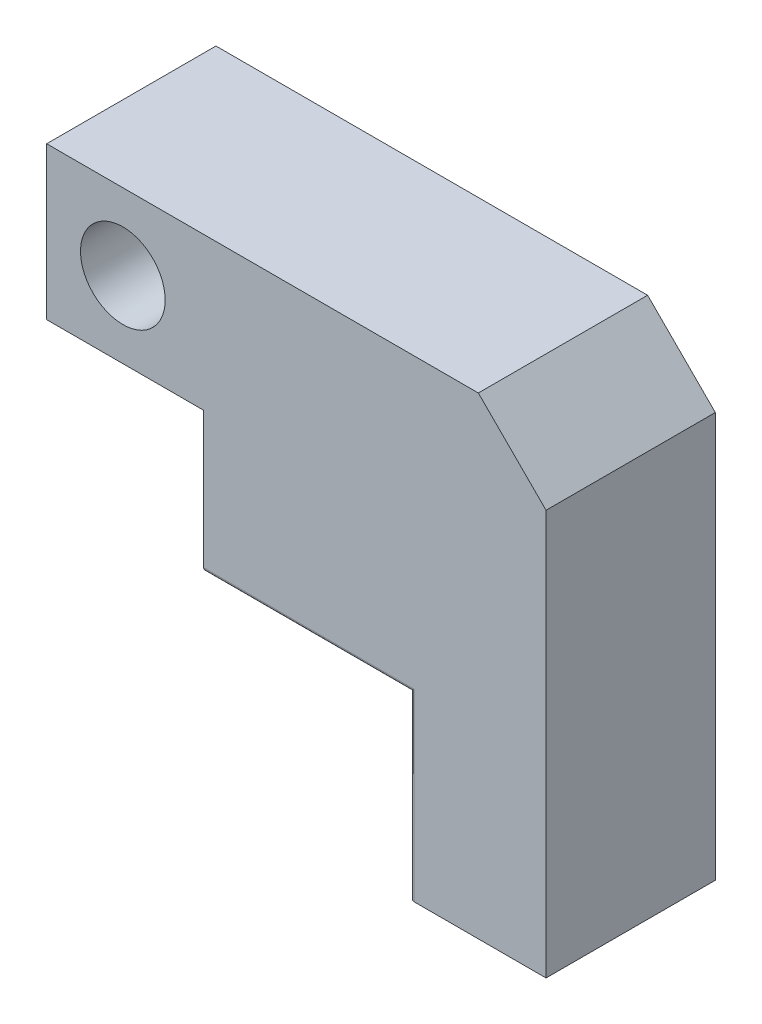
ISO-10303-21;
HEADER;
FILE_DESCRIPTION(('STEP AP214'),'2;1');
FILE_NAME('part.step','',(''),(''),'','','');
FILE_SCHEMA(('AUTOMOTIVE_DESIGN { 1 0 10303 214 1 1 1 1 }'));
ENDSEC;
DATA;
#1=APPLICATION_CONTEXT('core data for automotive mechanical design processes');
#2=APPLICATION_PROTOCOL_DEFINITION('international standard','automotive_design',2000,#1);
#3=PRODUCT_CONTEXT('',#1,'mechanical');
#4=PRODUCT('Part','Part','',(#3));
#5=PRODUCT_RELATED_PRODUCT_CATEGORY('part','',(#4));
#6=PRODUCT_DEFINITION_FORMATION('','',#4);
#7=PRODUCT_DEFINITION_CONTEXT('part definition',#1,'design');
#8=PRODUCT_DEFINITION('design','',#6,#7);
#9=PRODUCT_DEFINITION_SHAPE('','',#8);
#10=(LENGTH_UNIT() NAMED_UNIT(*) SI_UNIT(.MILLI.,.METRE.));
#11=(NAMED_UNIT(*) PLANE_ANGLE_UNIT() SI_UNIT($,.RADIAN.));
#12=(NAMED_UNIT(*) SI_UNIT($,.STERADIAN.) SOLID_ANGLE_UNIT());
#13=UNCERTAINTY_MEASURE_WITH_UNIT(LENGTH_MEASURE(1.E-05),#10,'distance_accuracy_value','');
#14=(GEOMETRIC_REPRESENTATION_CONTEXT(3) GLOBAL_UNCERTAINTY_ASSIGNED_CONTEXT((#13)) GLOBAL_UNIT_ASSIGNED_CONTEXT((#10,
#11,#12)) REPRESENTATION_CONTEXT('',''));
#15=CARTESIAN_POINT('',(0.,0.,0.));
#16=DIRECTION('',(0.,0.,1.));
#17=DIRECTION('',(1.,0.,0.));
#18=AXIS2_PLACEMENT_3D('',#15,#16,#17);
#19=CARTESIAN_POINT('',(25.0000000131859,-23.4294027338573,10.));
#20=DIRECTION('',(0.,0.,1.));
#21=DIRECTION('',(1.,0.,0.));
#22=AXIS2_PLACEMENT_3D('',#19,#20,#21);
#23=PLANE('',#22);
#24=DIRECTION('',(1.,0.,0.));
#25=VECTOR('',#24,1.);
#26=CARTESIAN_POINT('',(17.0000000131859,-12.5540845162202,10.));
#27=LINE('',#26,#25);
#28=CARTESIAN_POINT('',(4.77654226619651,-12.5540845162202,10.));
#29=VERTEX_POINT('',#28);
#30=CARTESIAN_POINT('',(17.2000000131859,-12.5540845162202,10.));
#31=VERTEX_POINT('',#30);
#32=EDGE_CURVE('E193',#29,#31,#27,.T.);
#33=ORIENTED_EDGE('',*,*,#32,.T.);
#34=DIRECTION('',(0.,-1.,0.));
#35=VECTOR('',#34,1.);
#36=CARTESIAN_POINT('',(17.2000000131859,-23.4294027338573,10.));
#37=LINE('',#36,#35);
#38=CARTESIAN_POINT('',(17.2000000131859,-23.4294027338573,10.));
#39=VERTEX_POINT('',#38);
#40=EDGE_CURVE('E195',#31,#39,#37,.T.);
#41=ORIENTED_EDGE('',*,*,#40,.T.);
#42=DIRECTION('',(1.,0.,0.));
#43=VECTOR('',#42,1.);
#44=CARTESIAN_POINT('',(17.0000000131859,-23.4294027338573,10.));
#45=LINE('',#44,#43);
#46=CARTESIAN_POINT('',(25.0000000131859,-23.4294027338573,10.));
#47=VERTEX_POINT('',#46);
#48=EDGE_CURVE('E157',#39,#47,#45,.T.);
#49=ORIENTED_EDGE('',*,*,#48,.T.);
#50=DIRECTION('',(0.,1.,0.));
#51=VECTOR('',#50,1.);
#52=CARTESIAN_POINT('',(25.0000000131859,4.5,10.));
#53=LINE('',#52,#51);
#54=CARTESIAN_POINT('',(25.0000000131859,0.499999999999998,10.));
#55=VERTEX_POINT('',#54);
#56=EDGE_CURVE('E134',#47,#55,#53,.T.);
#57=ORIENTED_EDGE('',*,*,#56,.T.);
#58=DIRECTION('',(0.707106781186546,-0.707106781186549,0.));
#59=VECTOR('',#58,1.);
#60=CARTESIAN_POINT('',(36.9647013801146,-11.4647013669287,10.));
#61=LINE('',#60,#59);
#62=CARTESIAN_POINT('',(21.0000000131859,4.5,10.));
#63=VERTEX_POINT('',#62);
#64=EDGE_CURVE('E130',#55,#63,#61,.F.);
#65=ORIENTED_EDGE('',*,*,#64,.T.);
#66=DIRECTION('',(-1.,0.,0.));
#67=VECTOR('',#66,1.);
#68=CARTESIAN_POINT('',(-4.5,4.5,10.));
#69=LINE('',#68,#67);
#70=CARTESIAN_POINT('',(-4.5,4.5,10.));
#71=VERTEX_POINT('',#70);
#72=EDGE_CURVE('E122',#63,#71,#69,.T.);
#73=ORIENTED_EDGE('',*,*,#72,.T.);
#74=DIRECTION('',(0.,-1.,0.));
#75=VECTOR('',#74,1.);
#76=CARTESIAN_POINT('',(-4.5,4.5,10.));
#77=LINE('',#76,#75);
#78=CARTESIAN_POINT('',(-4.5,-4.5,10.));
#79=VERTEX_POINT('',#78);
#80=EDGE_CURVE('E126',#71,#79,#77,.T.);
#81=ORIENTED_EDGE('',*,*,#80,.T.);
#82=DIRECTION('',(1.,0.,0.));
#83=VECTOR('',#82,1.);
#84=CARTESIAN_POINT('',(-4.5,-4.5,10.));
#85=LINE('',#84,#83);
#86=CARTESIAN_POINT('',(4.77654226619651,-4.5,10.));
#87=VERTEX_POINT('',#86);
#88=EDGE_CURVE('E149',#79,#87,#85,.T.);
#89=ORIENTED_EDGE('',*,*,#88,.T.);
#90=DIRECTION('',(0.,-1.,0.));
#91=VECTOR('',#90,1.);
#92=CARTESIAN_POINT('',(4.77654226619651,-4.5,10.));
#93=LINE('',#92,#91);
#94=EDGE_CURVE('E151',#87,#29,#93,.T.);
#95=ORIENTED_EDGE('',*,*,#94,.T.);
#96=EDGE_LOOP('',(#33,#41,#49,#57,#65,#73,#81,#89,#95));
#97=FACE_BOUND('',#96,.T.);
#98=CARTESIAN_POINT('',(0.,0.,10.));
#99=DIRECTION('',(0.,0.,1.));
#100=DIRECTION('',(1.,0.,0.));
#101=AXIS2_PLACEMENT_3D('',#98,#99,#100);
#102=CIRCLE('',#101,2.5);
#103=CARTESIAN_POINT('',(2.5,0.,10.));
#104=VERTEX_POINT('',#103);
#105=EDGE_CURVE('E163',#104,#104,#102,.T.);
#106=ORIENTED_EDGE('',*,*,#105,.F.);
#107=EDGE_LOOP('',(#106));
#108=FACE_BOUND('',#107,.T.);
#109=ADVANCED_FACE('F32',(#97,#108),#23,.T.);
#110=CARTESIAN_POINT('',(25.0000000131859,-23.4294027338573,0.));
#111=DIRECTION('',(0.,0.,1.));
#112=DIRECTION('',(1.,0.,0.));
#113=AXIS2_PLACEMENT_3D('',#110,#111,#112);
#114=PLANE('',#113);
#115=DIRECTION('',(1.,0.,0.));
#116=VECTOR('',#115,1.);
#117=CARTESIAN_POINT('',(17.0000000131859,-23.4294027338573,0.));
#118=LINE('',#117,#116);
#119=CARTESIAN_POINT('',(17.2000000131859,-23.4294027338573,0.));
#120=VERTEX_POINT('',#119);
#121=CARTESIAN_POINT('',(25.0000000131859,-23.4294027338573,0.));
#122=VERTEX_POINT('',#121);
#123=EDGE_CURVE('E171',#120,#122,#118,.T.);
#124=ORIENTED_EDGE('',*,*,#123,.F.);
#125=DIRECTION('',(0.,-1.,0.));
#126=VECTOR('',#125,1.);
#127=CARTESIAN_POINT('',(17.2000000131859,-23.4294027338573,0.));
#128=LINE('',#127,#126);
#129=CARTESIAN_POINT('',(17.2000000131859,-12.5540845162202,0.));
#130=VERTEX_POINT('',#129);
#131=EDGE_CURVE('E209',#120,#130,#128,.F.);
#132=ORIENTED_EDGE('',*,*,#131,.T.);
#133=DIRECTION('',(1.,0.,0.));
#134=VECTOR('',#133,1.);
#135=CARTESIAN_POINT('',(25.0000000131859,-12.5540845162202,0.));
#136=LINE('',#135,#134);
#137=CARTESIAN_POINT('',(4.77654226619651,-12.5540845162202,0.));
#138=VERTEX_POINT('',#137);
#139=EDGE_CURVE('E207',#130,#138,#136,.F.);
#140=ORIENTED_EDGE('',*,*,#139,.T.);
#141=DIRECTION('',(0.,-1.,0.));
#142=VECTOR('',#141,1.);
#143=CARTESIAN_POINT('',(4.77654226619651,-4.5,0.));
#144=LINE('',#143,#142);
#145=CARTESIAN_POINT('',(4.77654226619651,-4.5,0.));
#146=VERTEX_POINT('',#145);
#147=EDGE_CURVE('E169',#146,#138,#144,.T.);
#148=ORIENTED_EDGE('',*,*,#147,.F.);
#149=DIRECTION('',(1.,0.,0.));
#150=VECTOR('',#149,1.);
#151=CARTESIAN_POINT('',(-4.5,-4.5,0.));
#152=LINE('',#151,#150);
#153=CARTESIAN_POINT('',(-4.5,-4.5,0.));
#154=VERTEX_POINT('',#153);
#155=EDGE_CURVE('E167',#154,#146,#152,.T.);
#156=ORIENTED_EDGE('',*,*,#155,.F.);
#157=DIRECTION('',(0.,-1.,0.));
#158=VECTOR('',#157,1.);
#159=CARTESIAN_POINT('',(-4.5,4.5,0.));
#160=LINE('',#159,#158);
#161=CARTESIAN_POINT('',(-4.5,4.5,0.));
#162=VERTEX_POINT('',#161);
#163=EDGE_CURVE('E165',#162,#154,#160,.T.);
#164=ORIENTED_EDGE('',*,*,#163,.F.);
#165=DIRECTION('',(-1.,0.,0.));
#166=VECTOR('',#165,1.);
#167=CARTESIAN_POINT('',(-4.5,4.5,0.));
#168=LINE('',#167,#166);
#169=CARTESIAN_POINT('',(21.0000000131859,4.5,0.));
#170=VERTEX_POINT('',#169);
#171=EDGE_CURVE('E140',#170,#162,#168,.T.);
#172=ORIENTED_EDGE('',*,*,#171,.F.);
#173=DIRECTION('',(-0.707106781186546,0.707106781186549,0.));
#174=VECTOR('',#173,1.);
#175=CARTESIAN_POINT('',(21.0000000131859,4.5,0.));
#176=LINE('',#175,#174);
#177=CARTESIAN_POINT('',(25.0000000131859,0.499999999999989,0.));
#178=VERTEX_POINT('',#177);
#179=EDGE_CURVE('E188',#170,#178,#176,.F.);
#180=ORIENTED_EDGE('',*,*,#179,.T.);
#181=DIRECTION('',(0.,1.,0.));
#182=VECTOR('',#181,1.);
#183=CARTESIAN_POINT('',(25.0000000131859,4.5,0.));
#184=LINE('',#183,#182);
#185=EDGE_CURVE('E160',#122,#178,#184,.T.);
#186=ORIENTED_EDGE('',*,*,#185,.F.);
#187=EDGE_LOOP('',(#124,#132,#140,#148,#156,#164,#172,#180,#186));
#188=FACE_BOUND('',#187,.T.);
#189=CARTESIAN_POINT('',(0.,0.,0.));
#190=DIRECTION('',(0.,0.,1.));
#191=DIRECTION('',(1.,0.,0.));
#192=AXIS2_PLACEMENT_3D('',#189,#190,#191);
#193=CIRCLE('',#192,2.5);
#194=CARTESIAN_POINT('',(2.5,0.,0.));
#195=VERTEX_POINT('',#194);
#196=EDGE_CURVE('E418',#195,#195,#193,.T.);
#197=ORIENTED_EDGE('',*,*,#196,.T.);
#198=EDGE_LOOP('',(#197));
#199=FACE_BOUND('',#198,.T.);
#200=ADVANCED_FACE('F236',(#188,#199),#114,.F.);
#201=CARTESIAN_POINT('',(25.0000000131859,4.5,10.));
#202=DIRECTION('',(-1.,0.,0.));
#203=DIRECTION('',(0.,-1.,0.));
#204=AXIS2_PLACEMENT_3D('',#201,#202,#203);
#205=PLANE('',#204);
#206=ORIENTED_EDGE('',*,*,#185,.T.);
#207=DIRECTION('',(0.,0.,1.));
#208=VECTOR('',#207,1.);
#209=CARTESIAN_POINT('',(25.0000000131859,0.499999999999989,10.));
#210=LINE('',#209,#208);
#211=EDGE_CURVE('E190',#178,#55,#210,.T.);
#212=ORIENTED_EDGE('',*,*,#211,.T.);
#213=ORIENTED_EDGE('',*,*,#56,.F.);
#214=DIRECTION('',(0.,0.,-1.));
#215=VECTOR('',#214,1.);
#216=CARTESIAN_POINT('',(25.0000000131859,-23.4294027338573,10.));
#217=LINE('',#216,#215);
#218=EDGE_CURVE('E159',#47,#122,#217,.T.);
#219=ORIENTED_EDGE('',*,*,#218,.T.);
#220=EDGE_LOOP('',(#206,#212,#213,#219));
#221=FACE_BOUND('',#220,.T.);
#222=ADVANCED_FACE('F248',(#221),#205,.F.);
#223=CARTESIAN_POINT('',(-4.5,4.5,10.));
#224=DIRECTION('',(0.,-1.,0.));
#225=DIRECTION('',(0.,0.,-1.));
#226=AXIS2_PLACEMENT_3D('',#223,#224,#225);
#227=PLANE('',#226);
#228=ORIENTED_EDGE('',*,*,#72,.F.);
#229=DIRECTION('',(0.,0.,-1.));
#230=VECTOR('',#229,1.);
#231=CARTESIAN_POINT('',(21.0000000131859,4.5,10.));
#232=LINE('',#231,#230);
#233=EDGE_CURVE('E143',#63,#170,#232,.T.);
#234=ORIENTED_EDGE('',*,*,#233,.T.);
#235=ORIENTED_EDGE('',*,*,#171,.T.);
#236=DIRECTION('',(0.,0.,-1.));
#237=VECTOR('',#236,1.);
#238=CARTESIAN_POINT('',(-4.5,4.5,10.));
#239=LINE('',#238,#237);
#240=EDGE_CURVE('E137',#71,#162,#239,.T.);
#241=ORIENTED_EDGE('',*,*,#240,.F.);
#242=EDGE_LOOP('',(#228,#234,#235,#241));
#243=FACE_BOUND('',#242,.T.);
#244=ADVANCED_FACE('F138',(#243),#227,.F.);
#245=CARTESIAN_POINT('',(-4.5,4.5,10.));
#246=DIRECTION('',(1.,0.,0.));
#247=DIRECTION('',(0.,1.,0.));
#248=AXIS2_PLACEMENT_3D('',#245,#246,#247);
#249=PLANE('',#248);
#250=ORIENTED_EDGE('',*,*,#163,.T.);
#251=DIRECTION('',(0.,0.,-1.));
#252=VECTOR('',#251,1.);
#253=CARTESIAN_POINT('',(-4.5,-4.5,10.));
#254=LINE('',#253,#252);
#255=EDGE_CURVE('E144',#79,#154,#254,.T.);
#256=ORIENTED_EDGE('',*,*,#255,.F.);
#257=ORIENTED_EDGE('',*,*,#80,.F.);
#258=ORIENTED_EDGE('',*,*,#240,.T.);
#259=EDGE_LOOP('',(#250,#256,#257,#258));
#260=FACE_BOUND('',#259,.T.);
#261=ADVANCED_FACE('F146',(#260),#249,.F.);
#262=CARTESIAN_POINT('',(-4.5,-4.5,10.));
#263=DIRECTION('',(0.,1.,0.));
#264=DIRECTION('',(0.,0.,1.));
#265=AXIS2_PLACEMENT_3D('',#262,#263,#264);
#266=PLANE('',#265);
#267=ORIENTED_EDGE('',*,*,#155,.T.);
#268=DIRECTION('',(0.,0.,-1.));
#269=VECTOR('',#268,1.);
#270=CARTESIAN_POINT('',(4.77654226619651,-4.5,10.));
#271=LINE('',#270,#269);
#272=EDGE_CURVE('E183',#87,#146,#271,.T.);
#273=ORIENTED_EDGE('',*,*,#272,.F.);
#274=ORIENTED_EDGE('',*,*,#88,.F.);
#275=ORIENTED_EDGE('',*,*,#255,.T.);
#276=EDGE_LOOP('',(#267,#273,#274,#275));
#277=FACE_BOUND('',#276,.T.);
#278=ADVANCED_FACE('F243',(#277),#266,.F.);
#279=CARTESIAN_POINT('',(4.77654226619651,-4.5,10.));
#280=DIRECTION('',(1.,0.,0.));
#281=DIRECTION('',(0.,0.,-1.));
#282=AXIS2_PLACEMENT_3D('',#279,#280,#281);
#283=PLANE('',#282);
#284=ORIENTED_EDGE('',*,*,#147,.T.);
#285=CARTESIAN_POINT('',(4.77654226619651,-12.5540845162202,0.200000000000001));
#286=DIRECTION('',(1.,0.,0.));
#287=DIRECTION('',(0.,0.,-1.));
#288=AXIS2_PLACEMENT_3D('',#285,#286,#287);
#289=CIRCLE('',#288,0.2);
#290=CARTESIAN_POINT('',(4.77654226619651,-12.7540845162202,0.200000000000001));
#291=VERTEX_POINT('',#290);
#292=EDGE_CURVE('E11',#138,#291,#289,.F.);
#293=ORIENTED_EDGE('',*,*,#292,.T.);
#294=DIRECTION('',(0.,0.,-1.));
#295=VECTOR('',#294,1.);
#296=CARTESIAN_POINT('',(4.77654226619651,-12.7540845162202,10.));
#297=LINE('',#296,#295);
#298=CARTESIAN_POINT('',(4.77654226619651,-12.7540845162202,9.8));
#299=VERTEX_POINT('',#298);
#300=EDGE_CURVE('E181',#299,#291,#297,.T.);
#301=ORIENTED_EDGE('',*,*,#300,.F.);
#302=CARTESIAN_POINT('',(4.77654226619651,-12.5540845162202,9.8));
#303=DIRECTION('',(1.,0.,0.));
#304=DIRECTION('',(0.,0.,-1.));
#305=AXIS2_PLACEMENT_3D('',#302,#303,#304);
#306=CIRCLE('',#305,0.2);
#307=EDGE_CURVE('E41',#299,#29,#306,.F.);
#308=ORIENTED_EDGE('',*,*,#307,.T.);
#309=ORIENTED_EDGE('',*,*,#94,.F.);
#310=ORIENTED_EDGE('',*,*,#272,.T.);
#311=EDGE_LOOP('',(#284,#293,#301,#308,#309,#310));
#312=FACE_BOUND('',#311,.T.);
#313=ADVANCED_FACE('F239',(#312),#283,.F.);
#314=CARTESIAN_POINT('',(4.77654226619651,-12.7540845162202,10.));
#315=DIRECTION('',(0.,1.,0.));
#316=DIRECTION('',(0.,0.,1.));
#317=AXIS2_PLACEMENT_3D('',#314,#315,#316);
#318=PLANE('',#317);
#319=ORIENTED_EDGE('',*,*,#300,.T.);
#320=DIRECTION('',(1.,0.,0.));
#321=VECTOR('',#320,1.);
#322=CARTESIAN_POINT('',(4.77654226619651,-12.7540845162202,0.200000000000001));
#323=LINE('',#322,#321);
#324=CARTESIAN_POINT('',(17.0000000131859,-12.7540845162202,0.200000000000001));
#325=VERTEX_POINT('',#324);
#326=EDGE_CURVE('E212',#291,#325,#323,.T.);
#327=ORIENTED_EDGE('',*,*,#326,.T.);
#328=DIRECTION('',(0.,0.,-1.));
#329=VECTOR('',#328,1.);
#330=CARTESIAN_POINT('',(17.0000000131859,-12.7540845162202,10.));
#331=LINE('',#330,#329);
#332=CARTESIAN_POINT('',(17.0000000131859,-12.7540845162202,9.8));
#333=VERTEX_POINT('',#332);
#334=EDGE_CURVE('E178',#333,#325,#331,.T.);
#335=ORIENTED_EDGE('',*,*,#334,.F.);
#336=DIRECTION('',(1.,0.,0.));
#337=VECTOR('',#336,1.);
#338=CARTESIAN_POINT('',(4.77654226619651,-12.7540845162202,9.8));
#339=LINE('',#338,#337);
#340=EDGE_CURVE('E54',#333,#299,#339,.F.);
#341=ORIENTED_EDGE('',*,*,#340,.T.);
#342=EDGE_LOOP('',(#319,#327,#335,#341));
#343=FACE_BOUND('',#342,.T.);
#344=ADVANCED_FACE('F285',(#343),#318,.F.);
#345=CARTESIAN_POINT('',(17.0000000131859,-23.4294027338573,10.));
#346=DIRECTION('',(1.,0.,0.));
#347=DIRECTION('',(0.,0.,-1.));
#348=AXIS2_PLACEMENT_3D('',#345,#346,#347);
#349=PLANE('',#348);
#350=DIRECTION('',(0.,0.,-1.));
#351=VECTOR('',#350,1.);
#352=CARTESIAN_POINT('',(17.0000000131859,-23.4294027338573,10.));
#353=LINE('',#352,#351);
#354=CARTESIAN_POINT('',(17.0000000131859,-23.4294027338573,9.8));
#355=VERTEX_POINT('',#354);
#356=CARTESIAN_POINT('',(17.0000000131859,-23.4294027338573,0.200000000000001));
#357=VERTEX_POINT('',#356);
#358=EDGE_CURVE('E175',#355,#357,#353,.T.);
#359=ORIENTED_EDGE('',*,*,#358,.F.);
#360=DIRECTION('',(0.,-1.,0.));
#361=VECTOR('',#360,1.);
#362=CARTESIAN_POINT('',(17.0000000131859,-12.7540845162202,9.8));
#363=LINE('',#362,#361);
#364=EDGE_CURVE('E205',#355,#333,#363,.F.);
#365=ORIENTED_EDGE('',*,*,#364,.T.);
#366=ORIENTED_EDGE('',*,*,#334,.T.);
#367=DIRECTION('',(0.,-1.,0.));
#368=VECTOR('',#367,1.);
#369=CARTESIAN_POINT('',(17.0000000131859,-23.4294027338573,0.200000000000001));
#370=LINE('',#369,#368);
#371=EDGE_CURVE('E202',#325,#357,#370,.T.);
#372=ORIENTED_EDGE('',*,*,#371,.T.);
#373=EDGE_LOOP('',(#359,#365,#366,#372));
#374=FACE_BOUND('',#373,.T.);
#375=ADVANCED_FACE('F281',(#374),#349,.F.);
#376=CARTESIAN_POINT('',(17.0000000131859,-23.4294027338573,10.));
#377=DIRECTION('',(0.,1.,0.));
#378=DIRECTION('',(0.,0.,1.));
#379=AXIS2_PLACEMENT_3D('',#376,#377,#378);
#380=PLANE('',#379);
#381=CARTESIAN_POINT('',(21.0000000131859,-23.4294027338573,5.));
#382=DIRECTION('',(0.,-1.,0.));
#383=DIRECTION('',(0.,0.,-1.));
#384=AXIS2_PLACEMENT_3D('',#381,#382,#383);
#385=CIRCLE('',#384,2.5);
#386=CARTESIAN_POINT('',(21.0000000131859,-23.4294027338573,2.5));
#387=VERTEX_POINT('',#386);
#388=EDGE_CURVE('E216',#387,#387,#385,.T.);
#389=ORIENTED_EDGE('',*,*,#388,.F.);
#390=EDGE_LOOP('',(#389));
#391=FACE_BOUND('',#390,.T.);
#392=ORIENTED_EDGE('',*,*,#48,.F.);
#393=CARTESIAN_POINT('',(17.2000000131859,-23.4294027338573,9.8));
#394=DIRECTION('',(0.,1.,0.));
#395=DIRECTION('',(0.,0.,1.));
#396=AXIS2_PLACEMENT_3D('',#393,#394,#395);
#397=CIRCLE('',#396,0.2);
#398=EDGE_CURVE('E200',#39,#355,#397,.F.);
#399=ORIENTED_EDGE('',*,*,#398,.T.);
#400=ORIENTED_EDGE('',*,*,#358,.T.);
#401=CARTESIAN_POINT('',(17.2000000131859,-23.4294027338573,0.200000000000001));
#402=DIRECTION('',(0.,1.,0.));
#403=DIRECTION('',(0.,0.,1.));
#404=AXIS2_PLACEMENT_3D('',#401,#402,#403);
#405=CIRCLE('',#404,0.2);
#406=EDGE_CURVE('E198',#357,#120,#405,.F.);
#407=ORIENTED_EDGE('',*,*,#406,.T.);
#408=ORIENTED_EDGE('',*,*,#123,.T.);
#409=ORIENTED_EDGE('',*,*,#218,.F.);
#410=EDGE_LOOP('',(#392,#399,#400,#407,#408,#409));
#411=FACE_BOUND('',#410,.T.);
#412=ADVANCED_FACE('F278',(#391,#411),#380,.F.);
#413=CARTESIAN_POINT('',(0.,0.,10.));
#414=DIRECTION('',(0.,0.,-1.));
#415=DIRECTION('',(-1.,0.,0.));
#416=AXIS2_PLACEMENT_3D('',#413,#414,#415);
#417=CYLINDRICAL_SURFACE('',#416,2.5);
#418=ORIENTED_EDGE('',*,*,#105,.T.);
#419=EDGE_LOOP('',(#418));
#420=FACE_BOUND('',#419,.T.);
#421=ORIENTED_EDGE('',*,*,#196,.F.);
#422=EDGE_LOOP('',(#421));
#423=FACE_BOUND('',#422,.T.);
#424=ADVANCED_FACE('F275',(#420,#423),#417,.F.);
#425=CARTESIAN_POINT('',(21.0000000131859,-3.4294027338573,5.));
#426=DIRECTION('',(0.,-1.,0.));
#427=DIRECTION('',(0.,0.,-1.));
#428=AXIS2_PLACEMENT_3D('',#425,#426,#427);
#429=CYLINDRICAL_SURFACE('',#428,2.5);
#430=CARTESIAN_POINT('',(21.0000000131859,-3.4294027338573,5.));
#431=DIRECTION('',(0.,-1.,0.));
#432=DIRECTION('',(0.,0.,-1.));
#433=AXIS2_PLACEMENT_3D('',#430,#431,#432);
#434=CIRCLE('',#433,2.5);
#435=CARTESIAN_POINT('',(21.0000000131859,-3.4294027338573,2.5));
#436=VERTEX_POINT('',#435);
#437=EDGE_CURVE('E222',#436,#436,#434,.T.);
#438=ORIENTED_EDGE('',*,*,#437,.F.);
#439=EDGE_LOOP('',(#438));
#440=FACE_BOUND('',#439,.T.);
#441=ORIENTED_EDGE('',*,*,#388,.T.);
#442=EDGE_LOOP('',(#441));
#443=FACE_BOUND('',#442,.T.);
#444=ADVANCED_FACE('F263',(#440,#443),#429,.F.);
#445=CARTESIAN_POINT('',(21.0000000131859,-3.4294027338573,5.));
#446=DIRECTION('',(0.,-1.,0.));
#447=DIRECTION('',(0.,0.,-1.));
#448=AXIS2_PLACEMENT_3D('',#445,#446,#447);
#449=PLANE('',#448);
#450=ORIENTED_EDGE('',*,*,#437,.T.);
#451=EDGE_LOOP('',(#450));
#452=FACE_BOUND('',#451,.T.);
#453=ADVANCED_FACE('F254',(#452),#449,.T.);
#454=CARTESIAN_POINT('',(21.0000000131859,4.5,10.));
#455=DIRECTION('',(-0.707106781186549,-0.707106781186546,0.));
#456=DIRECTION('',(0.707106781186546,-0.707106781186549,0.));
#457=AXIS2_PLACEMENT_3D('',#454,#455,#456);
#458=PLANE('',#457);
#459=ORIENTED_EDGE('',*,*,#64,.F.);
#460=ORIENTED_EDGE('',*,*,#211,.F.);
#461=ORIENTED_EDGE('',*,*,#179,.F.);
#462=ORIENTED_EDGE('',*,*,#233,.F.);
#463=EDGE_LOOP('',(#459,#460,#461,#462));
#464=FACE_BOUND('',#463,.T.);
#465=ADVANCED_FACE('F251',(#464),#458,.F.);
#466=CARTESIAN_POINT('',(25.0000000131859,-12.5540845162202,9.8));
#467=DIRECTION('',(-1.,0.,0.));
#468=DIRECTION('',(0.,0.,1.));
#469=AXIS2_PLACEMENT_3D('',#466,#467,#468);
#470=CYLINDRICAL_SURFACE('',#469,0.2);
#471=ORIENTED_EDGE('',*,*,#307,.F.);
#472=ORIENTED_EDGE('',*,*,#340,.F.);
#473=CARTESIAN_POINT('',(17.2000000131859,-12.5540845162202,9.8));
#474=DIRECTION('',(-0.707106781186547,0.707106781186547,0.));
#475=DIRECTION('',(0.707106781186547,0.707106781186547,0.));
#476=AXIS2_PLACEMENT_3D('',#473,#474,#475);
#477=ELLIPSE('',#476,0.282842712474619,0.2);
#478=EDGE_CURVE('E214',#31,#333,#477,.F.);
#479=ORIENTED_EDGE('',*,*,#478,.F.);
#480=ORIENTED_EDGE('',*,*,#32,.F.);
#481=EDGE_LOOP('',(#471,#472,#479,#480));
#482=FACE_BOUND('',#481,.T.);
#483=ADVANCED_FACE('F253',(#482),#470,.T.);
#484=CARTESIAN_POINT('',(17.2000000131859,-23.4294027338573,9.8));
#485=DIRECTION('',(0.,1.,0.));
#486=DIRECTION('',(0.,0.,1.));
#487=AXIS2_PLACEMENT_3D('',#484,#485,#486);
#488=CYLINDRICAL_SURFACE('',#487,0.2);
#489=ORIENTED_EDGE('',*,*,#478,.T.);
#490=ORIENTED_EDGE('',*,*,#364,.F.);
#491=ORIENTED_EDGE('',*,*,#398,.F.);
#492=ORIENTED_EDGE('',*,*,#40,.F.);
#493=EDGE_LOOP('',(#489,#490,#491,#492));
#494=FACE_BOUND('',#493,.T.);
#495=ADVANCED_FACE('F260',(#494),#488,.T.);
#496=CARTESIAN_POINT('',(4.77654226619651,-12.5540845162202,0.200000000000001));
#497=DIRECTION('',(1.,0.,0.));
#498=DIRECTION('',(0.,0.,-1.));
#499=AXIS2_PLACEMENT_3D('',#496,#497,#498);
#500=CYLINDRICAL_SURFACE('',#499,0.2);
#501=ORIENTED_EDGE('',*,*,#292,.F.);
#502=ORIENTED_EDGE('',*,*,#139,.F.);
#503=CARTESIAN_POINT('',(17.2000000131859,-12.5540845162202,0.200000000000001));
#504=DIRECTION('',(0.707106781186547,-0.707106781186547,0.));
#505=DIRECTION('',(-0.707106781186547,-0.707106781186547,0.));
#506=AXIS2_PLACEMENT_3D('',#503,#504,#505);
#507=ELLIPSE('',#506,0.282842712474619,0.2);
#508=EDGE_CURVE('E36',#325,#130,#507,.T.);
#509=ORIENTED_EDGE('',*,*,#508,.F.);
#510=ORIENTED_EDGE('',*,*,#326,.F.);
#511=EDGE_LOOP('',(#501,#502,#509,#510));
#512=FACE_BOUND('',#511,.T.);
#513=ADVANCED_FACE('F34',(#512),#500,.T.);
#514=CARTESIAN_POINT('',(17.2000000131859,-23.4294027338573,0.200000000000001));
#515=DIRECTION('',(0.,-1.,0.));
#516=DIRECTION('',(0.,0.,-1.));
#517=AXIS2_PLACEMENT_3D('',#514,#515,#516);
#518=CYLINDRICAL_SURFACE('',#517,0.2);
#519=ORIENTED_EDGE('',*,*,#508,.T.);
#520=ORIENTED_EDGE('',*,*,#131,.F.);
#521=ORIENTED_EDGE('',*,*,#406,.F.);
#522=ORIENTED_EDGE('',*,*,#371,.F.);
#523=EDGE_LOOP('',(#519,#520,#521,#522));
#524=FACE_BOUND('',#523,.T.);
#525=ADVANCED_FACE('F229',(#524),#518,.T.);
#526=CLOSED_SHELL('',(#109,#200,#222,#244,#261,#278,#313,#344,#375,#412,#424,#444,#453,#465,
#483,#495,#513,#525));
#527=MANIFOLD_SOLID_BREP('B2',#526);
#528=ADVANCED_BREP_SHAPE_REPRESENTATION('',(#18,#527),#14);
#529=SHAPE_DEFINITION_REPRESENTATION(#9,#528);
ENDSEC;
END-ISO-10303-21;
